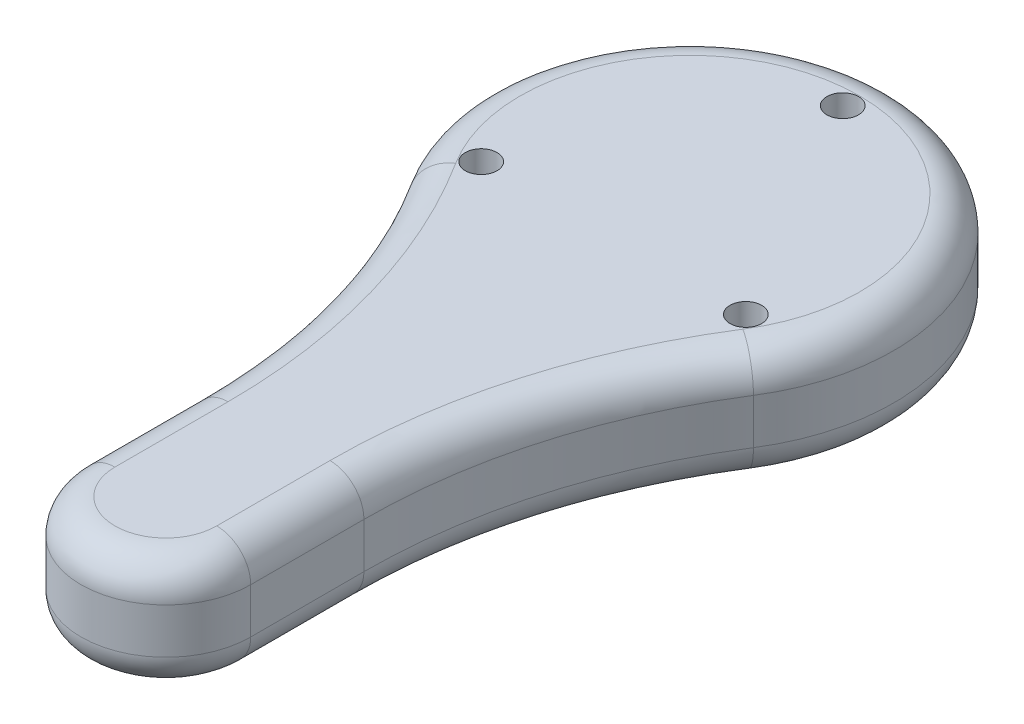
ISO-10303-21;
HEADER;
FILE_DESCRIPTION(('STEP AP214'),'2;1');
FILE_NAME('part.step','',(''),(''),'','','');
FILE_SCHEMA(('AUTOMOTIVE_DESIGN { 1 0 10303 214 1 1 1 1 }'));
ENDSEC;
DATA;
#1=APPLICATION_CONTEXT('core data for automotive mechanical design processes');
#2=APPLICATION_PROTOCOL_DEFINITION('international standard','automotive_design',2000,#1);
#3=PRODUCT_CONTEXT('',#1,'mechanical');
#4=PRODUCT('Part','Part','',(#3));
#5=PRODUCT_RELATED_PRODUCT_CATEGORY('part','',(#4));
#6=PRODUCT_DEFINITION_FORMATION('','',#4);
#7=PRODUCT_DEFINITION_CONTEXT('part definition',#1,'design');
#8=PRODUCT_DEFINITION('design','',#6,#7);
#9=PRODUCT_DEFINITION_SHAPE('','',#8);
#10=(LENGTH_UNIT() NAMED_UNIT(*) SI_UNIT(.MILLI.,.METRE.));
#11=(NAMED_UNIT(*) PLANE_ANGLE_UNIT() SI_UNIT($,.RADIAN.));
#12=(NAMED_UNIT(*) SI_UNIT($,.STERADIAN.) SOLID_ANGLE_UNIT());
#13=UNCERTAINTY_MEASURE_WITH_UNIT(LENGTH_MEASURE(1.E-05),#10,'distance_accuracy_value','');
#14=(GEOMETRIC_REPRESENTATION_CONTEXT(3) GLOBAL_UNCERTAINTY_ASSIGNED_CONTEXT((#13)) GLOBAL_UNIT_ASSIGNED_CONTEXT((#10,
#11,#12)) REPRESENTATION_CONTEXT('',''));
#15=CARTESIAN_POINT('',(0.,0.,0.));
#16=DIRECTION('',(0.,0.,1.));
#17=DIRECTION('',(1.,0.,0.));
#18=AXIS2_PLACEMENT_3D('',#15,#16,#17);
#19=CARTESIAN_POINT('',(57.5,10.,36.3008264368739));
#20=DIRECTION('',(0.,-1.,0.));
#21=DIRECTION('',(0.,0.,-1.));
#22=AXIS2_PLACEMENT_3D('',#19,#20,#21);
#23=CYLINDRICAL_SURFACE('',#22,50.);
#24=DIRECTION('',(0.,-1.,0.));
#25=VECTOR('',#24,1.);
#26=CARTESIAN_POINT('',(7.5,10.,36.3008264368739));
#27=LINE('',#26,#25);
#28=CARTESIAN_POINT('',(7.5,7.,36.3008264368739));
#29=VERTEX_POINT('',#28);
#30=CARTESIAN_POINT('',(7.5,3.,36.3008264368739));
#31=VERTEX_POINT('',#30);
#32=EDGE_CURVE('E250',#29,#31,#27,.T.);
#33=ORIENTED_EDGE('',*,*,#32,.T.);
#34=CARTESIAN_POINT('',(57.5,3.,36.3008264368739));
#35=DIRECTION('',(0.,1.,0.));
#36=DIRECTION('',(0.,0.,1.));
#37=AXIS2_PLACEMENT_3D('',#34,#35,#36);
#38=CIRCLE('',#37,50.);
#39=CARTESIAN_POINT('',(15.2205882352942,3.,9.60904229211375));
#40=VERTEX_POINT('',#39);
#41=EDGE_CURVE('E220',#31,#40,#38,.F.);
#42=ORIENTED_EDGE('',*,*,#41,.T.);
#43=DIRECTION('',(0.,-1.,0.));
#44=VECTOR('',#43,1.);
#45=CARTESIAN_POINT('',(15.2205882352942,10.,9.60904229211375));
#46=LINE('',#45,#44);
#47=CARTESIAN_POINT('',(15.2205882352942,7.,9.60904229211375));
#48=VERTEX_POINT('',#47);
#49=EDGE_CURVE('E162',#48,#40,#46,.T.);
#50=ORIENTED_EDGE('',*,*,#49,.F.);
#51=CARTESIAN_POINT('',(57.5,7.,36.3008264368739));
#52=DIRECTION('',(0.,1.,0.));
#53=DIRECTION('',(0.,0.,1.));
#54=AXIS2_PLACEMENT_3D('',#51,#52,#53);
#55=CIRCLE('',#54,50.);
#56=EDGE_CURVE('E218',#48,#29,#55,.T.);
#57=ORIENTED_EDGE('',*,*,#56,.T.);
#58=EDGE_LOOP('',(#33,#42,#50,#57));
#59=FACE_BOUND('',#58,.T.);
#60=ADVANCED_FACE('F42',(#59),#23,.F.);
#61=CARTESIAN_POINT('',(0.,10.,0.));
#62=DIRECTION('',(0.,-1.,0.));
#63=DIRECTION('',(0.,0.,-1.));
#64=AXIS2_PLACEMENT_3D('',#61,#62,#63);
#65=CYLINDRICAL_SURFACE('',#64,18.0000000000002);
#66=ORIENTED_EDGE('',*,*,#49,.T.);
#67=CARTESIAN_POINT('',(0.,3.,0.));
#68=DIRECTION('',(0.,1.,0.));
#69=DIRECTION('',(0.,0.,1.));
#70=AXIS2_PLACEMENT_3D('',#67,#68,#69);
#71=CIRCLE('',#70,18.0000000000002);
#72=CARTESIAN_POINT('',(-15.2205882352942,3.,9.60904229211375));
#73=VERTEX_POINT('',#72);
#74=EDGE_CURVE('E161',#40,#73,#71,.T.);
#75=ORIENTED_EDGE('',*,*,#74,.T.);
#76=DIRECTION('',(0.,-1.,0.));
#77=VECTOR('',#76,1.);
#78=CARTESIAN_POINT('',(-15.2205882352942,10.,9.60904229211375));
#79=LINE('',#78,#77);
#80=CARTESIAN_POINT('',(-15.2205882352942,7.,9.60904229211375));
#81=VERTEX_POINT('',#80);
#82=EDGE_CURVE('E143',#81,#73,#79,.T.);
#83=ORIENTED_EDGE('',*,*,#82,.F.);
#84=CARTESIAN_POINT('',(0.,7.,0.));
#85=DIRECTION('',(0.,1.,0.));
#86=DIRECTION('',(0.,0.,1.));
#87=AXIS2_PLACEMENT_3D('',#84,#85,#86);
#88=CIRCLE('',#87,18.0000000000002);
#89=EDGE_CURVE('E158',#81,#48,#88,.F.);
#90=ORIENTED_EDGE('',*,*,#89,.T.);
#91=EDGE_LOOP('',(#66,#75,#83,#90));
#92=FACE_BOUND('',#91,.T.);
#93=ADVANCED_FACE('F156',(#92),#65,.T.);
#94=CARTESIAN_POINT('',(-57.5,10.,36.3008264368739));
#95=DIRECTION('',(0.,-1.,0.));
#96=DIRECTION('',(0.,0.,-1.));
#97=AXIS2_PLACEMENT_3D('',#94,#95,#96);
#98=CYLINDRICAL_SURFACE('',#97,50.);
#99=ORIENTED_EDGE('',*,*,#82,.T.);
#100=CARTESIAN_POINT('',(-57.5,3.,36.3008264368739));
#101=DIRECTION('',(0.,1.,0.));
#102=DIRECTION('',(0.,0.,1.));
#103=AXIS2_PLACEMENT_3D('',#100,#101,#102);
#104=CIRCLE('',#103,50.);
#105=CARTESIAN_POINT('',(-7.49999999999996,3.,36.3008264368739));
#106=VERTEX_POINT('',#105);
#107=EDGE_CURVE('E150',#73,#106,#104,.F.);
#108=ORIENTED_EDGE('',*,*,#107,.T.);
#109=DIRECTION('',(0.,-1.,0.));
#110=VECTOR('',#109,1.);
#111=CARTESIAN_POINT('',(-7.49999999999996,10.,36.3008264368739));
#112=LINE('',#111,#110);
#113=CARTESIAN_POINT('',(-7.49999999999996,7.,36.3008264368739));
#114=VERTEX_POINT('',#113);
#115=EDGE_CURVE('E145',#114,#106,#112,.T.);
#116=ORIENTED_EDGE('',*,*,#115,.F.);
#117=CARTESIAN_POINT('',(-57.5,7.,36.3008264368739));
#118=DIRECTION('',(0.,1.,0.));
#119=DIRECTION('',(0.,0.,1.));
#120=AXIS2_PLACEMENT_3D('',#117,#118,#119);
#121=CIRCLE('',#120,50.);
#122=EDGE_CURVE('E140',#114,#81,#121,.T.);
#123=ORIENTED_EDGE('',*,*,#122,.T.);
#124=EDGE_LOOP('',(#99,#108,#116,#123));
#125=FACE_BOUND('',#124,.T.);
#126=ADVANCED_FACE('F142',(#125),#98,.F.);
#127=CARTESIAN_POINT('',(-7.5,10.,36.3008264368739));
#128=DIRECTION('',(1.,0.,0.));
#129=DIRECTION('',(0.,0.,-1.));
#130=AXIS2_PLACEMENT_3D('',#127,#128,#129);
#131=PLANE('',#130);
#132=ORIENTED_EDGE('',*,*,#115,.T.);
#133=DIRECTION('',(0.,0.,1.));
#134=VECTOR('',#133,1.);
#135=CARTESIAN_POINT('',(-7.5,3.,36.3008264368739));
#136=LINE('',#135,#134);
#137=CARTESIAN_POINT('',(-7.5,3.,46.3008264368739));
#138=VERTEX_POINT('',#137);
#139=EDGE_CURVE('E205',#106,#138,#136,.T.);
#140=ORIENTED_EDGE('',*,*,#139,.T.);
#141=DIRECTION('',(0.,-1.,0.));
#142=VECTOR('',#141,1.);
#143=CARTESIAN_POINT('',(-7.5,10.,46.3008264368739));
#144=LINE('',#143,#142);
#145=CARTESIAN_POINT('',(-7.5,7.,46.3008264368739));
#146=VERTEX_POINT('',#145);
#147=EDGE_CURVE('E271',#146,#138,#144,.T.);
#148=ORIENTED_EDGE('',*,*,#147,.F.);
#149=DIRECTION('',(0.,0.,1.));
#150=VECTOR('',#149,1.);
#151=CARTESIAN_POINT('',(-7.5,7.,36.3008264368739));
#152=LINE('',#151,#150);
#153=EDGE_CURVE('E203',#146,#114,#152,.F.);
#154=ORIENTED_EDGE('',*,*,#153,.T.);
#155=EDGE_LOOP('',(#132,#140,#148,#154));
#156=FACE_BOUND('',#155,.T.);
#157=ADVANCED_FACE('F268',(#156),#131,.F.);
#158=CARTESIAN_POINT('',(0.,10.,46.3008264368739));
#159=DIRECTION('',(0.,-1.,0.));
#160=DIRECTION('',(0.,0.,-1.));
#161=AXIS2_PLACEMENT_3D('',#158,#159,#160);
#162=CYLINDRICAL_SURFACE('',#161,7.5);
#163=ORIENTED_EDGE('',*,*,#147,.T.);
#164=CARTESIAN_POINT('',(0.,3.,46.3008264368739));
#165=DIRECTION('',(0.,1.,0.));
#166=DIRECTION('',(0.,0.,1.));
#167=AXIS2_PLACEMENT_3D('',#164,#165,#166);
#168=CIRCLE('',#167,7.5);
#169=CARTESIAN_POINT('',(7.5,3.,46.3008264368739));
#170=VERTEX_POINT('',#169);
#171=EDGE_CURVE('E209',#138,#170,#168,.T.);
#172=ORIENTED_EDGE('',*,*,#171,.T.);
#173=DIRECTION('',(0.,-1.,0.));
#174=VECTOR('',#173,1.);
#175=CARTESIAN_POINT('',(7.5,10.,46.3008264368739));
#176=LINE('',#175,#174);
#177=CARTESIAN_POINT('',(7.5,7.,46.3008264368739));
#178=VERTEX_POINT('',#177);
#179=EDGE_CURVE('E274',#178,#170,#176,.T.);
#180=ORIENTED_EDGE('',*,*,#179,.F.);
#181=CARTESIAN_POINT('',(0.,7.,46.3008264368739));
#182=DIRECTION('',(0.,1.,0.));
#183=DIRECTION('',(0.,0.,1.));
#184=AXIS2_PLACEMENT_3D('',#181,#182,#183);
#185=CIRCLE('',#184,7.5);
#186=EDGE_CURVE('E207',#178,#146,#185,.F.);
#187=ORIENTED_EDGE('',*,*,#186,.T.);
#188=EDGE_LOOP('',(#163,#172,#180,#187));
#189=FACE_BOUND('',#188,.T.);
#190=ADVANCED_FACE('F438',(#189),#162,.T.);
#191=CARTESIAN_POINT('',(7.5,10.,36.3008264368739));
#192=DIRECTION('',(-1.,0.,0.));
#193=DIRECTION('',(0.,0.,1.));
#194=AXIS2_PLACEMENT_3D('',#191,#192,#193);
#195=PLANE('',#194);
#196=ORIENTED_EDGE('',*,*,#179,.T.);
#197=DIRECTION('',(0.,0.,-1.));
#198=VECTOR('',#197,1.);
#199=CARTESIAN_POINT('',(7.5,3.,36.3008264368739));
#200=LINE('',#199,#198);
#201=EDGE_CURVE('E215',#170,#31,#200,.T.);
#202=ORIENTED_EDGE('',*,*,#201,.T.);
#203=ORIENTED_EDGE('',*,*,#32,.F.);
#204=DIRECTION('',(0.,0.,-1.));
#205=VECTOR('',#204,1.);
#206=CARTESIAN_POINT('',(7.5,7.,46.3008264368739));
#207=LINE('',#206,#205);
#208=EDGE_CURVE('E211',#29,#178,#207,.F.);
#209=ORIENTED_EDGE('',*,*,#208,.T.);
#210=EDGE_LOOP('',(#196,#202,#203,#209));
#211=FACE_BOUND('',#210,.T.);
#212=ADVANCED_FACE('F318',(#211),#195,.F.);
#213=CARTESIAN_POINT('',(57.5,10.,36.3008264368739));
#214=DIRECTION('',(0.,1.,0.));
#215=DIRECTION('',(0.,0.,1.));
#216=AXIS2_PLACEMENT_3D('',#213,#214,#215);
#217=PLANE('',#216);
#218=CARTESIAN_POINT('',(-1.15971982188188E-13,10.,-13.5));
#219=DIRECTION('',(0.,1.,0.));
#220=DIRECTION('',(0.,0.,1.));
#221=AXIS2_PLACEMENT_3D('',#218,#219,#220);
#222=CIRCLE('',#221,1.4);
#223=CARTESIAN_POINT('',(-1.15971982188188E-13,10.,-12.1));
#224=VERTEX_POINT('',#223);
#225=EDGE_CURVE('E297',#224,#224,#222,.T.);
#226=ORIENTED_EDGE('',*,*,#225,.F.);
#227=EDGE_LOOP('',(#226));
#228=FACE_BOUND('',#227,.T.);
#229=CARTESIAN_POINT('',(-11.6913429510899,10.,6.7500000000001));
#230=DIRECTION('',(0.,1.,0.));
#231=DIRECTION('',(0.,0.,1.));
#232=AXIS2_PLACEMENT_3D('',#229,#230,#231);
#233=CIRCLE('',#232,1.4);
#234=CARTESIAN_POINT('',(-11.6913429510899,10.,8.1500000000001));
#235=VERTEX_POINT('',#234);
#236=EDGE_CURVE('E294',#235,#235,#233,.T.);
#237=ORIENTED_EDGE('',*,*,#236,.F.);
#238=EDGE_LOOP('',(#237));
#239=FACE_BOUND('',#238,.T.);
#240=CARTESIAN_POINT('',(11.69134295109,10.,6.7499999999999));
#241=DIRECTION('',(0.,1.,0.));
#242=DIRECTION('',(0.,0.,1.));
#243=AXIS2_PLACEMENT_3D('',#240,#241,#242);
#244=CIRCLE('',#243,1.4);
#245=CARTESIAN_POINT('',(11.69134295109,10.,8.1499999999999));
#246=VERTEX_POINT('',#245);
#247=EDGE_CURVE('E287',#246,#246,#244,.T.);
#248=ORIENTED_EDGE('',*,*,#247,.F.);
#249=EDGE_LOOP('',(#248));
#250=FACE_BOUND('',#249,.T.);
#251=CARTESIAN_POINT('',(0.,10.,46.3008264368739));
#252=DIRECTION('',(0.,1.,0.));
#253=DIRECTION('',(0.,0.,1.));
#254=AXIS2_PLACEMENT_3D('',#251,#252,#253);
#255=CIRCLE('',#254,4.5);
#256=CARTESIAN_POINT('',(-4.5,10.,46.3008264368739));
#257=VERTEX_POINT('',#256);
#258=CARTESIAN_POINT('',(4.5,10.,46.3008264368739));
#259=VERTEX_POINT('',#258);
#260=EDGE_CURVE('E51',#257,#259,#255,.T.);
#261=ORIENTED_EDGE('',*,*,#260,.T.);
#262=DIRECTION('',(0.,0.,-1.));
#263=VECTOR('',#262,1.);
#264=CARTESIAN_POINT('',(4.5,10.,36.3008264368739));
#265=LINE('',#264,#263);
#266=CARTESIAN_POINT('',(4.49999999999996,10.,36.3008264368739));
#267=VERTEX_POINT('',#266);
#268=EDGE_CURVE('E11',#259,#267,#265,.T.);
#269=ORIENTED_EDGE('',*,*,#268,.T.);
#270=CARTESIAN_POINT('',(57.5,10.,36.3008264368739));
#271=DIRECTION('',(0.,1.,0.));
#272=DIRECTION('',(0.,0.,1.));
#273=AXIS2_PLACEMENT_3D('',#270,#271,#272);
#274=CIRCLE('',#273,53.);
#275=CARTESIAN_POINT('',(12.6838235294119,10.,8.00753524342817));
#276=VERTEX_POINT('',#275);
#277=EDGE_CURVE('E222',#267,#276,#274,.F.);
#278=ORIENTED_EDGE('',*,*,#277,.T.);
#279=CARTESIAN_POINT('',(0.,10.,0.));
#280=DIRECTION('',(0.,1.,0.));
#281=DIRECTION('',(0.,0.,1.));
#282=AXIS2_PLACEMENT_3D('',#279,#280,#281);
#283=CIRCLE('',#282,15.0000000000002);
#284=CARTESIAN_POINT('',(-12.6838235294119,10.,8.00753524342815));
#285=VERTEX_POINT('',#284);
#286=EDGE_CURVE('E225',#276,#285,#283,.T.);
#287=ORIENTED_EDGE('',*,*,#286,.T.);
#288=CARTESIAN_POINT('',(-57.5,10.,36.3008264368739));
#289=DIRECTION('',(0.,1.,0.));
#290=DIRECTION('',(0.,0.,1.));
#291=AXIS2_PLACEMENT_3D('',#288,#289,#290);
#292=CIRCLE('',#291,53.);
#293=CARTESIAN_POINT('',(-4.49999999999996,10.,36.3008264368739));
#294=VERTEX_POINT('',#293);
#295=EDGE_CURVE('E167',#285,#294,#292,.F.);
#296=ORIENTED_EDGE('',*,*,#295,.T.);
#297=DIRECTION('',(0.,0.,1.));
#298=VECTOR('',#297,1.);
#299=CARTESIAN_POINT('',(-4.5,10.,46.3008264368739));
#300=LINE('',#299,#298);
#301=EDGE_CURVE('E62',#294,#257,#300,.T.);
#302=ORIENTED_EDGE('',*,*,#301,.T.);
#303=EDGE_LOOP('',(#261,#269,#278,#287,#296,#302));
#304=FACE_BOUND('',#303,.T.);
#305=ADVANCED_FACE('F315',(#228,#239,#250,#304),#217,.T.);
#306=CARTESIAN_POINT('',(57.5,0.,36.3008264368739));
#307=DIRECTION('',(0.,1.,0.));
#308=DIRECTION('',(0.,0.,1.));
#309=AXIS2_PLACEMENT_3D('',#306,#307,#308);
#310=PLANE('',#309);
#311=CARTESIAN_POINT('',(-1.15971982188188E-13,0.,-13.5));
#312=DIRECTION('',(0.,1.,0.));
#313=DIRECTION('',(0.,0.,1.));
#314=AXIS2_PLACEMENT_3D('',#311,#312,#313);
#315=CIRCLE('',#314,1.4);
#316=CARTESIAN_POINT('',(-1.15971982188188E-13,0.,-12.1));
#317=VERTEX_POINT('',#316);
#318=EDGE_CURVE('E255',#317,#317,#315,.T.);
#319=ORIENTED_EDGE('',*,*,#318,.T.);
#320=EDGE_LOOP('',(#319));
#321=FACE_BOUND('',#320,.T.);
#322=CARTESIAN_POINT('',(-11.6913429510899,0.,6.7500000000001));
#323=DIRECTION('',(0.,1.,0.));
#324=DIRECTION('',(0.,0.,1.));
#325=AXIS2_PLACEMENT_3D('',#322,#323,#324);
#326=CIRCLE('',#325,1.4);
#327=CARTESIAN_POINT('',(-11.6913429510899,0.,8.1500000000001));
#328=VERTEX_POINT('',#327);
#329=EDGE_CURVE('E291',#328,#328,#326,.T.);
#330=ORIENTED_EDGE('',*,*,#329,.T.);
#331=EDGE_LOOP('',(#330));
#332=FACE_BOUND('',#331,.T.);
#333=CARTESIAN_POINT('',(11.69134295109,0.,6.7499999999999));
#334=DIRECTION('',(0.,1.,0.));
#335=DIRECTION('',(0.,0.,1.));
#336=AXIS2_PLACEMENT_3D('',#333,#334,#335);
#337=CIRCLE('',#336,1.4);
#338=CARTESIAN_POINT('',(11.69134295109,0.,8.1499999999999));
#339=VERTEX_POINT('',#338);
#340=EDGE_CURVE('E283',#339,#339,#337,.T.);
#341=ORIENTED_EDGE('',*,*,#340,.T.);
#342=EDGE_LOOP('',(#341));
#343=FACE_BOUND('',#342,.T.);
#344=CARTESIAN_POINT('',(-57.5,0.,36.3008264368739));
#345=DIRECTION('',(0.,1.,0.));
#346=DIRECTION('',(0.,0.,1.));
#347=AXIS2_PLACEMENT_3D('',#344,#345,#346);
#348=CIRCLE('',#347,53.);
#349=CARTESIAN_POINT('',(-4.5,0.,36.3008264368739));
#350=VERTEX_POINT('',#349);
#351=CARTESIAN_POINT('',(-12.6838235294119,0.,8.00753524342817));
#352=VERTEX_POINT('',#351);
#353=EDGE_CURVE('E196',#350,#352,#348,.T.);
#354=ORIENTED_EDGE('',*,*,#353,.T.);
#355=CARTESIAN_POINT('',(0.,0.,0.));
#356=DIRECTION('',(0.,1.,0.));
#357=DIRECTION('',(0.,0.,1.));
#358=AXIS2_PLACEMENT_3D('',#355,#356,#357);
#359=CIRCLE('',#358,15.0000000000002);
#360=CARTESIAN_POINT('',(12.6838235294119,0.,8.00753524342817));
#361=VERTEX_POINT('',#360);
#362=EDGE_CURVE('E151',#352,#361,#359,.F.);
#363=ORIENTED_EDGE('',*,*,#362,.T.);
#364=CARTESIAN_POINT('',(57.5,0.,36.3008264368739));
#365=DIRECTION('',(0.,1.,0.));
#366=DIRECTION('',(0.,0.,1.));
#367=AXIS2_PLACEMENT_3D('',#364,#365,#366);
#368=CIRCLE('',#367,53.);
#369=CARTESIAN_POINT('',(4.49999999999996,0.,36.3008264368739));
#370=VERTEX_POINT('',#369);
#371=EDGE_CURVE('E181',#361,#370,#368,.T.);
#372=ORIENTED_EDGE('',*,*,#371,.T.);
#373=DIRECTION('',(0.,0.,-1.));
#374=VECTOR('',#373,1.);
#375=CARTESIAN_POINT('',(4.5,0.,36.3008264368739));
#376=LINE('',#375,#374);
#377=CARTESIAN_POINT('',(4.5,0.,46.3008264368739));
#378=VERTEX_POINT('',#377);
#379=EDGE_CURVE('E188',#370,#378,#376,.F.);
#380=ORIENTED_EDGE('',*,*,#379,.T.);
#381=CARTESIAN_POINT('',(0.,0.,46.3008264368739));
#382=DIRECTION('',(0.,1.,0.));
#383=DIRECTION('',(0.,0.,1.));
#384=AXIS2_PLACEMENT_3D('',#381,#382,#383);
#385=CIRCLE('',#384,4.5);
#386=CARTESIAN_POINT('',(-4.5,0.,46.3008264368739));
#387=VERTEX_POINT('',#386);
#388=EDGE_CURVE('E191',#378,#387,#385,.F.);
#389=ORIENTED_EDGE('',*,*,#388,.T.);
#390=DIRECTION('',(0.,0.,1.));
#391=VECTOR('',#390,1.);
#392=CARTESIAN_POINT('',(-4.5,0.,36.3008264368739));
#393=LINE('',#392,#391);
#394=EDGE_CURVE('E193',#387,#350,#393,.F.);
#395=ORIENTED_EDGE('',*,*,#394,.T.);
#396=EDGE_LOOP('',(#354,#363,#372,#380,#389,#395));
#397=FACE_BOUND('',#396,.T.);
#398=ADVANCED_FACE('F305',(#321,#332,#343,#397),#310,.F.);
#399=CARTESIAN_POINT('',(0.,3.,46.3008264368739));
#400=DIRECTION('',(0.,1.,0.));
#401=DIRECTION('',(0.,0.,1.));
#402=AXIS2_PLACEMENT_3D('',#399,#400,#401);
#403=TOROIDAL_SURFACE('',#402,4.5,3.);
#404=CARTESIAN_POINT('',(-4.5,3.,46.3008264368739));
#405=DIRECTION('',(0.,0.,-1.));
#406=DIRECTION('',(-1.,0.,0.));
#407=AXIS2_PLACEMENT_3D('',#404,#405,#406);
#408=CIRCLE('',#407,3.);
#409=EDGE_CURVE('E244',#387,#138,#408,.T.);
#410=ORIENTED_EDGE('',*,*,#409,.F.);
#411=ORIENTED_EDGE('',*,*,#388,.F.);
#412=CARTESIAN_POINT('',(4.5,3.,46.3008264368739));
#413=DIRECTION('',(0.,0.,-1.));
#414=DIRECTION('',(-1.,0.,0.));
#415=AXIS2_PLACEMENT_3D('',#412,#413,#414);
#416=CIRCLE('',#415,3.);
#417=EDGE_CURVE('E247',#170,#378,#416,.T.);
#418=ORIENTED_EDGE('',*,*,#417,.F.);
#419=ORIENTED_EDGE('',*,*,#171,.F.);
#420=EDGE_LOOP('',(#410,#411,#418,#419));
#421=FACE_BOUND('',#420,.T.);
#422=ADVANCED_FACE('F367',(#421),#403,.T.);
#423=CARTESIAN_POINT('',(4.5,3.,36.3008264368739));
#424=DIRECTION('',(0.,0.,-1.));
#425=DIRECTION('',(-1.,0.,0.));
#426=AXIS2_PLACEMENT_3D('',#423,#424,#425);
#427=CYLINDRICAL_SURFACE('',#426,3.);
#428=ORIENTED_EDGE('',*,*,#417,.T.);
#429=ORIENTED_EDGE('',*,*,#379,.F.);
#430=CARTESIAN_POINT('',(4.5,3.,36.3008264368739));
#431=DIRECTION('',(0.,0.,-1.));
#432=DIRECTION('',(-1.,0.,0.));
#433=AXIS2_PLACEMENT_3D('',#430,#431,#432);
#434=CIRCLE('',#433,3.);
#435=EDGE_CURVE('E240',#31,#370,#434,.T.);
#436=ORIENTED_EDGE('',*,*,#435,.F.);
#437=ORIENTED_EDGE('',*,*,#201,.F.);
#438=EDGE_LOOP('',(#428,#429,#436,#437));
#439=FACE_BOUND('',#438,.T.);
#440=ADVANCED_FACE('F363',(#439),#427,.T.);
#441=CARTESIAN_POINT('',(-4.5,3.,36.3008264368739));
#442=DIRECTION('',(0.,0.,1.));
#443=DIRECTION('',(1.,0.,0.));
#444=AXIS2_PLACEMENT_3D('',#441,#442,#443);
#445=CYLINDRICAL_SURFACE('',#444,3.);
#446=ORIENTED_EDGE('',*,*,#409,.T.);
#447=ORIENTED_EDGE('',*,*,#139,.F.);
#448=CARTESIAN_POINT('',(-4.5,3.,36.3008264368739));
#449=DIRECTION('',(0.,0.,-1.));
#450=DIRECTION('',(-1.,0.,0.));
#451=AXIS2_PLACEMENT_3D('',#448,#449,#450);
#452=CIRCLE('',#451,3.);
#453=EDGE_CURVE('E236',#350,#106,#452,.T.);
#454=ORIENTED_EDGE('',*,*,#453,.F.);
#455=ORIENTED_EDGE('',*,*,#394,.F.);
#456=EDGE_LOOP('',(#446,#447,#454,#455));
#457=FACE_BOUND('',#456,.T.);
#458=ADVANCED_FACE('F359',(#457),#445,.T.);
#459=CARTESIAN_POINT('',(57.5,3.,36.3008264368739));
#460=DIRECTION('',(0.,1.,0.));
#461=DIRECTION('',(0.,0.,1.));
#462=AXIS2_PLACEMENT_3D('',#459,#460,#461);
#463=TOROIDAL_SURFACE('',#462,53.,3.);
#464=ORIENTED_EDGE('',*,*,#435,.T.);
#465=ORIENTED_EDGE('',*,*,#371,.F.);
#466=CARTESIAN_POINT('',(12.6838235294119,3.,8.00753524342817));
#467=DIRECTION('',(0.533835682895202,0.,-0.845588235294114));
#468=DIRECTION('',(-0.845588235294114,0.,-0.533835682895202));
#469=AXIS2_PLACEMENT_3D('',#466,#467,#468);
#470=CIRCLE('',#469,3.);
#471=EDGE_CURVE('E233',#40,#361,#470,.T.);
#472=ORIENTED_EDGE('',*,*,#471,.F.);
#473=ORIENTED_EDGE('',*,*,#41,.F.);
#474=EDGE_LOOP('',(#464,#465,#472,#473));
#475=FACE_BOUND('',#474,.T.);
#476=ADVANCED_FACE('F355',(#475),#463,.T.);
#477=CARTESIAN_POINT('',(-57.5,3.,36.3008264368739));
#478=DIRECTION('',(0.,1.,0.));
#479=DIRECTION('',(0.,0.,1.));
#480=AXIS2_PLACEMENT_3D('',#477,#478,#479);
#481=TOROIDAL_SURFACE('',#480,53.,3.);
#482=ORIENTED_EDGE('',*,*,#453,.T.);
#483=ORIENTED_EDGE('',*,*,#107,.F.);
#484=CARTESIAN_POINT('',(-12.6838235294119,3.,8.00753524342817));
#485=DIRECTION('',(-0.533835682895201,0.,-0.845588235294114));
#486=DIRECTION('',(-0.845588235294114,0.,0.533835682895201));
#487=AXIS2_PLACEMENT_3D('',#484,#485,#486);
#488=CIRCLE('',#487,3.);
#489=EDGE_CURVE('E231',#352,#73,#488,.T.);
#490=ORIENTED_EDGE('',*,*,#489,.F.);
#491=ORIENTED_EDGE('',*,*,#353,.F.);
#492=EDGE_LOOP('',(#482,#483,#490,#491));
#493=FACE_BOUND('',#492,.T.);
#494=ADVANCED_FACE('F351',(#493),#481,.T.);
#495=CARTESIAN_POINT('',(0.,3.,0.));
#496=DIRECTION('',(0.,1.,0.));
#497=DIRECTION('',(0.,0.,1.));
#498=AXIS2_PLACEMENT_3D('',#495,#496,#497);
#499=TOROIDAL_SURFACE('',#498,15.0000000000002,3.);
#500=ORIENTED_EDGE('',*,*,#471,.T.);
#501=ORIENTED_EDGE('',*,*,#362,.F.);
#502=ORIENTED_EDGE('',*,*,#489,.T.);
#503=ORIENTED_EDGE('',*,*,#74,.F.);
#504=EDGE_LOOP('',(#500,#501,#502,#503));
#505=FACE_BOUND('',#504,.T.);
#506=ADVANCED_FACE('F348',(#505),#499,.T.);
#507=CARTESIAN_POINT('',(-57.5,7.,36.3008264368739));
#508=DIRECTION('',(0.,1.,0.));
#509=DIRECTION('',(0.,0.,1.));
#510=AXIS2_PLACEMENT_3D('',#507,#508,#509);
#511=TOROIDAL_SURFACE('',#510,53.,3.);
#512=CARTESIAN_POINT('',(-12.6838235294119,7.,8.00753524342817));
#513=DIRECTION('',(-0.533835682895201,0.,-0.845588235294114));
#514=DIRECTION('',(-0.845588235294114,0.,0.533835682895201));
#515=AXIS2_PLACEMENT_3D('',#512,#513,#514);
#516=CIRCLE('',#515,3.);
#517=EDGE_CURVE('E166',#81,#285,#516,.T.);
#518=ORIENTED_EDGE('',*,*,#517,.F.);
#519=ORIENTED_EDGE('',*,*,#122,.F.);
#520=CARTESIAN_POINT('',(-4.49999999999996,7.,36.3008264368739));
#521=DIRECTION('',(0.,0.,1.));
#522=DIRECTION('',(1.,0.,0.));
#523=AXIS2_PLACEMENT_3D('',#520,#521,#522);
#524=CIRCLE('',#523,3.);
#525=EDGE_CURVE('E46',#294,#114,#524,.T.);
#526=ORIENTED_EDGE('',*,*,#525,.F.);
#527=ORIENTED_EDGE('',*,*,#295,.F.);
#528=EDGE_LOOP('',(#518,#519,#526,#527));
#529=FACE_BOUND('',#528,.T.);
#530=ADVANCED_FACE('F44',(#529),#511,.T.);
#531=CARTESIAN_POINT('',(-4.5,7.,36.3008264368739));
#532=DIRECTION('',(0.,0.,-1.));
#533=DIRECTION('',(-1.,0.,0.));
#534=AXIS2_PLACEMENT_3D('',#531,#532,#533);
#535=CYLINDRICAL_SURFACE('',#534,3.);
#536=ORIENTED_EDGE('',*,*,#525,.T.);
#537=ORIENTED_EDGE('',*,*,#153,.F.);
#538=CARTESIAN_POINT('',(-4.5,7.,46.3008264368739));
#539=DIRECTION('',(0.,0.,1.));
#540=DIRECTION('',(1.,0.,0.));
#541=AXIS2_PLACEMENT_3D('',#538,#539,#540);
#542=CIRCLE('',#541,3.);
#543=EDGE_CURVE('E170',#257,#146,#542,.T.);
#544=ORIENTED_EDGE('',*,*,#543,.F.);
#545=ORIENTED_EDGE('',*,*,#301,.F.);
#546=EDGE_LOOP('',(#536,#537,#544,#545));
#547=FACE_BOUND('',#546,.T.);
#548=ADVANCED_FACE('F265',(#547),#535,.T.);
#549=CARTESIAN_POINT('',(0.,7.,0.));
#550=DIRECTION('',(0.,1.,0.));
#551=DIRECTION('',(0.,0.,1.));
#552=AXIS2_PLACEMENT_3D('',#549,#550,#551);
#553=TOROIDAL_SURFACE('',#552,15.0000000000002,3.);
#554=ORIENTED_EDGE('',*,*,#517,.T.);
#555=ORIENTED_EDGE('',*,*,#286,.F.);
#556=CARTESIAN_POINT('',(12.6838235294119,7.,8.00753524342815));
#557=DIRECTION('',(-0.533835682895202,0.,0.845588235294114));
#558=DIRECTION('',(0.845588235294114,0.,0.533835682895202));
#559=AXIS2_PLACEMENT_3D('',#556,#557,#558);
#560=CIRCLE('',#559,3.);
#561=EDGE_CURVE('E174',#48,#276,#560,.T.);
#562=ORIENTED_EDGE('',*,*,#561,.F.);
#563=ORIENTED_EDGE('',*,*,#89,.F.);
#564=EDGE_LOOP('',(#554,#555,#562,#563));
#565=FACE_BOUND('',#564,.T.);
#566=ADVANCED_FACE('F172',(#565),#553,.T.);
#567=CARTESIAN_POINT('',(0.,7.,46.3008264368739));
#568=DIRECTION('',(0.,1.,0.));
#569=DIRECTION('',(0.,0.,1.));
#570=AXIS2_PLACEMENT_3D('',#567,#568,#569);
#571=TOROIDAL_SURFACE('',#570,4.5,3.);
#572=ORIENTED_EDGE('',*,*,#543,.T.);
#573=ORIENTED_EDGE('',*,*,#186,.F.);
#574=CARTESIAN_POINT('',(4.5,7.,46.3008264368739));
#575=DIRECTION('',(0.,0.,-1.));
#576=DIRECTION('',(-1.,0.,0.));
#577=AXIS2_PLACEMENT_3D('',#574,#575,#576);
#578=CIRCLE('',#577,3.);
#579=EDGE_CURVE('E254',#259,#178,#578,.T.);
#580=ORIENTED_EDGE('',*,*,#579,.F.);
#581=ORIENTED_EDGE('',*,*,#260,.F.);
#582=EDGE_LOOP('',(#572,#573,#580,#581));
#583=FACE_BOUND('',#582,.T.);
#584=ADVANCED_FACE('F262',(#583),#571,.T.);
#585=CARTESIAN_POINT('',(57.5,7.,36.3008264368739));
#586=DIRECTION('',(0.,1.,0.));
#587=DIRECTION('',(0.,0.,1.));
#588=AXIS2_PLACEMENT_3D('',#585,#586,#587);
#589=TOROIDAL_SURFACE('',#588,53.,3.);
#590=ORIENTED_EDGE('',*,*,#561,.T.);
#591=ORIENTED_EDGE('',*,*,#277,.F.);
#592=CARTESIAN_POINT('',(4.49999999999996,7.,36.3008264368739));
#593=DIRECTION('',(0.,0.,1.));
#594=DIRECTION('',(1.,0.,0.));
#595=AXIS2_PLACEMENT_3D('',#592,#593,#594);
#596=CIRCLE('',#595,3.);
#597=EDGE_CURVE('E251',#29,#267,#596,.T.);
#598=ORIENTED_EDGE('',*,*,#597,.F.);
#599=ORIENTED_EDGE('',*,*,#56,.F.);
#600=EDGE_LOOP('',(#590,#591,#598,#599));
#601=FACE_BOUND('',#600,.T.);
#602=ADVANCED_FACE('F335',(#601),#589,.T.);
#603=CARTESIAN_POINT('',(4.5,7.,36.3008264368739));
#604=DIRECTION('',(0.,0.,1.));
#605=DIRECTION('',(1.,0.,0.));
#606=AXIS2_PLACEMENT_3D('',#603,#604,#605);
#607=CYLINDRICAL_SURFACE('',#606,3.);
#608=ORIENTED_EDGE('',*,*,#579,.T.);
#609=ORIENTED_EDGE('',*,*,#208,.F.);
#610=ORIENTED_EDGE('',*,*,#597,.T.);
#611=ORIENTED_EDGE('',*,*,#268,.F.);
#612=EDGE_LOOP('',(#608,#609,#610,#611));
#613=FACE_BOUND('',#612,.T.);
#614=ADVANCED_FACE('F326',(#613),#607,.T.);
#615=CARTESIAN_POINT('',(11.69134295109,0.,6.7499999999999));
#616=DIRECTION('',(0.,1.,0.));
#617=DIRECTION('',(0.,0.,1.));
#618=AXIS2_PLACEMENT_3D('',#615,#616,#617);
#619=CYLINDRICAL_SURFACE('',#618,1.4);
#620=ORIENTED_EDGE('',*,*,#340,.F.);
#621=EDGE_LOOP('',(#620));
#622=FACE_BOUND('',#621,.T.);
#623=ORIENTED_EDGE('',*,*,#247,.T.);
#624=EDGE_LOOP('',(#623));
#625=FACE_BOUND('',#624,.T.);
#626=ADVANCED_FACE('F324',(#622,#625),#619,.F.);
#627=CARTESIAN_POINT('',(-11.6913429510899,0.,6.7500000000001));
#628=DIRECTION('',(0.,1.,0.));
#629=DIRECTION('',(0.,0.,1.));
#630=AXIS2_PLACEMENT_3D('',#627,#628,#629);
#631=CYLINDRICAL_SURFACE('',#630,1.4);
#632=ORIENTED_EDGE('',*,*,#329,.F.);
#633=EDGE_LOOP('',(#632));
#634=FACE_BOUND('',#633,.T.);
#635=ORIENTED_EDGE('',*,*,#236,.T.);
#636=EDGE_LOOP('',(#635));
#637=FACE_BOUND('',#636,.T.);
#638=ADVANCED_FACE('F311',(#634,#637),#631,.F.);
#639=CARTESIAN_POINT('',(-1.15971982188188E-13,0.,-13.5));
#640=DIRECTION('',(0.,1.,0.));
#641=DIRECTION('',(0.,0.,1.));
#642=AXIS2_PLACEMENT_3D('',#639,#640,#641);
#643=CYLINDRICAL_SURFACE('',#642,1.4);
#644=ORIENTED_EDGE('',*,*,#318,.F.);
#645=EDGE_LOOP('',(#644));
#646=FACE_BOUND('',#645,.T.);
#647=ORIENTED_EDGE('',*,*,#225,.T.);
#648=EDGE_LOOP('',(#647));
#649=FACE_BOUND('',#648,.T.);
#650=ADVANCED_FACE('F308',(#646,#649),#643,.F.);
#651=CLOSED_SHELL('',(#60,#93,#126,#157,#190,#212,#305,#398,#422,#440,#458,#476,#494,#506,#530,
#548,#566,#584,#602,#614,#626,#638,#650));
#652=MANIFOLD_SOLID_BREP('B2',#651);
#653=ADVANCED_BREP_SHAPE_REPRESENTATION('',(#18,#652),#14);
#654=SHAPE_DEFINITION_REPRESENTATION(#9,#653);
ENDSEC;
END-ISO-10303-21;
